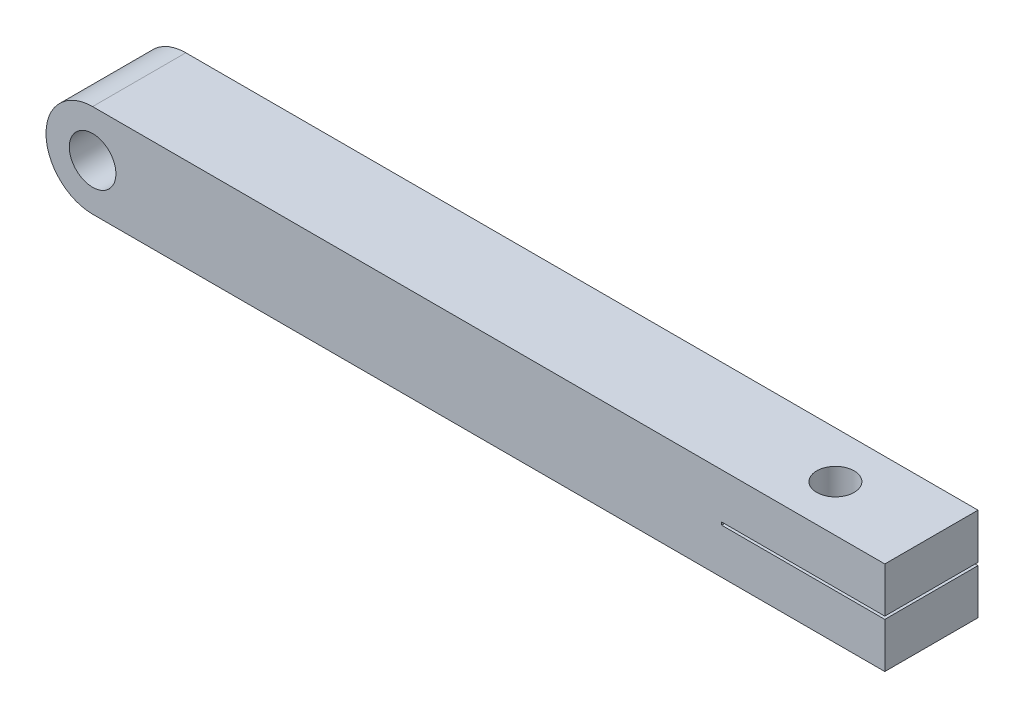
ISO-10303-21;
HEADER;
FILE_DESCRIPTION(('STEP AP214'),'2;1');
FILE_NAME('part.step','',(''),(''),'','','');
FILE_SCHEMA(('AUTOMOTIVE_DESIGN { 1 0 10303 214 1 1 1 1 }'));
ENDSEC;
DATA;
#1=APPLICATION_CONTEXT('core data for automotive mechanical design processes');
#2=APPLICATION_PROTOCOL_DEFINITION('international standard','automotive_design',2000,#1);
#3=PRODUCT_CONTEXT('',#1,'mechanical');
#4=PRODUCT('Part','Part','',(#3));
#5=PRODUCT_RELATED_PRODUCT_CATEGORY('part','',(#4));
#6=PRODUCT_DEFINITION_FORMATION('','',#4);
#7=PRODUCT_DEFINITION_CONTEXT('part definition',#1,'design');
#8=PRODUCT_DEFINITION('design','',#6,#7);
#9=PRODUCT_DEFINITION_SHAPE('','',#8);
#10=(LENGTH_UNIT() NAMED_UNIT(*) SI_UNIT(.MILLI.,.METRE.));
#11=(NAMED_UNIT(*) PLANE_ANGLE_UNIT() SI_UNIT($,.RADIAN.));
#12=(NAMED_UNIT(*) SI_UNIT($,.STERADIAN.) SOLID_ANGLE_UNIT());
#13=UNCERTAINTY_MEASURE_WITH_UNIT(LENGTH_MEASURE(1.E-05),#10,'distance_accuracy_value','');
#14=(GEOMETRIC_REPRESENTATION_CONTEXT(3) GLOBAL_UNCERTAINTY_ASSIGNED_CONTEXT((#13)) GLOBAL_UNIT_ASSIGNED_CONTEXT((#10,
#11,#12)) REPRESENTATION_CONTEXT('',''));
#15=CARTESIAN_POINT('',(0.,0.,0.));
#16=DIRECTION('',(0.,0.,1.));
#17=DIRECTION('',(1.,0.,0.));
#18=AXIS2_PLACEMENT_3D('',#15,#16,#17);
#19=CARTESIAN_POINT('',(0.,0.,12.7));
#20=DIRECTION('',(0.,0.,1.));
#21=DIRECTION('',(1.,0.,0.));
#22=AXIS2_PLACEMENT_3D('',#19,#20,#21);
#23=PLANE('',#22);
#24=DIRECTION('',(0.,1.,0.));
#25=VECTOR('',#24,1.);
#26=CARTESIAN_POINT('',(107.95,6.35,12.7));
#27=LINE('',#26,#25);
#28=CARTESIAN_POINT('',(107.95,0.190500000000001,12.7));
#29=VERTEX_POINT('',#28);
#30=CARTESIAN_POINT('',(107.95,6.35,12.7));
#31=VERTEX_POINT('',#30);
#32=EDGE_CURVE('E151',#29,#31,#27,.T.);
#33=ORIENTED_EDGE('',*,*,#32,.T.);
#34=DIRECTION('',(-1.,0.,0.));
#35=VECTOR('',#34,1.);
#36=CARTESIAN_POINT('',(0.,6.35,12.7));
#37=LINE('',#36,#35);
#38=CARTESIAN_POINT('',(0.,6.35,12.7));
#39=VERTEX_POINT('',#38);
#40=EDGE_CURVE('E99',#31,#39,#37,.T.);
#41=ORIENTED_EDGE('',*,*,#40,.T.);
#42=CARTESIAN_POINT('',(0.,0.,12.7));
#43=DIRECTION('',(0.,0.,1.));
#44=DIRECTION('',(1.,0.,0.));
#45=AXIS2_PLACEMENT_3D('',#42,#43,#44);
#46=CIRCLE('',#45,6.35000000000002);
#47=CARTESIAN_POINT('',(7.14267211143019E-07,-6.34999999999998,12.7));
#48=VERTEX_POINT('',#47);
#49=EDGE_CURVE('E167',#39,#48,#46,.T.);
#50=ORIENTED_EDGE('',*,*,#49,.T.);
#51=DIRECTION('',(1.,0.,0.));
#52=VECTOR('',#51,1.);
#53=CARTESIAN_POINT('',(7.1426721568596E-07,-6.35,12.7));
#54=LINE('',#53,#52);
#55=CARTESIAN_POINT('',(107.95,-6.35,12.7));
#56=VERTEX_POINT('',#55);
#57=EDGE_CURVE('E180',#48,#56,#54,.T.);
#58=ORIENTED_EDGE('',*,*,#57,.T.);
#59=DIRECTION('',(0.,1.,0.));
#60=VECTOR('',#59,1.);
#61=CARTESIAN_POINT('',(107.95,-6.35,12.7));
#62=LINE('',#61,#60);
#63=CARTESIAN_POINT('',(107.95,-0.1905,12.7));
#64=VERTEX_POINT('',#63);
#65=EDGE_CURVE('E118',#56,#64,#62,.T.);
#66=ORIENTED_EDGE('',*,*,#65,.T.);
#67=DIRECTION('',(-1.,0.,0.));
#68=VECTOR('',#67,1.);
#69=CARTESIAN_POINT('',(85.725,-0.1905,12.7));
#70=LINE('',#69,#68);
#71=CARTESIAN_POINT('',(85.725,-0.1905,12.7));
#72=VERTEX_POINT('',#71);
#73=EDGE_CURVE('E112',#64,#72,#70,.T.);
#74=ORIENTED_EDGE('',*,*,#73,.T.);
#75=DIRECTION('',(0.,1.,0.));
#76=VECTOR('',#75,1.);
#77=CARTESIAN_POINT('',(85.725,0.190500000000001,12.7));
#78=LINE('',#77,#76);
#79=CARTESIAN_POINT('',(85.725,0.190500000000001,12.7));
#80=VERTEX_POINT('',#79);
#81=EDGE_CURVE('E116',#72,#80,#78,.T.);
#82=ORIENTED_EDGE('',*,*,#81,.T.);
#83=DIRECTION('',(1.,0.,0.));
#84=VECTOR('',#83,1.);
#85=CARTESIAN_POINT('',(107.95,0.190500000000001,12.7));
#86=LINE('',#85,#84);
#87=EDGE_CURVE('E56',#80,#29,#86,.T.);
#88=ORIENTED_EDGE('',*,*,#87,.T.);
#89=EDGE_LOOP('',(#33,#41,#50,#58,#66,#74,#82,#88));
#90=FACE_BOUND('',#89,.T.);
#91=CARTESIAN_POINT('',(0.,0.,12.7));
#92=DIRECTION('',(0.,0.,1.));
#93=DIRECTION('',(1.,0.,0.));
#94=AXIS2_PLACEMENT_3D('',#91,#92,#93);
#95=CIRCLE('',#94,3.175);
#96=CARTESIAN_POINT('',(3.175,0.,12.7));
#97=VERTEX_POINT('',#96);
#98=EDGE_CURVE('E140',#97,#97,#95,.T.);
#99=ORIENTED_EDGE('',*,*,#98,.F.);
#100=EDGE_LOOP('',(#99));
#101=FACE_BOUND('',#100,.T.);
#102=ADVANCED_FACE('F38',(#90,#101),#23,.T.);
#103=CARTESIAN_POINT('',(0.,0.,0.));
#104=DIRECTION('',(0.,0.,1.));
#105=DIRECTION('',(1.,0.,0.));
#106=AXIS2_PLACEMENT_3D('',#103,#104,#105);
#107=PLANE('',#106);
#108=DIRECTION('',(0.,1.,0.));
#109=VECTOR('',#108,1.);
#110=CARTESIAN_POINT('',(107.95,6.35,0.));
#111=LINE('',#110,#109);
#112=CARTESIAN_POINT('',(107.95,0.190500000000001,0.));
#113=VERTEX_POINT('',#112);
#114=CARTESIAN_POINT('',(107.95,6.35,0.));
#115=VERTEX_POINT('',#114);
#116=EDGE_CURVE('E136',#113,#115,#111,.T.);
#117=ORIENTED_EDGE('',*,*,#116,.F.);
#118=DIRECTION('',(1.,0.,0.));
#119=VECTOR('',#118,1.);
#120=CARTESIAN_POINT('',(107.95,0.190500000000001,0.));
#121=LINE('',#120,#119);
#122=CARTESIAN_POINT('',(85.725,0.190500000000001,0.));
#123=VERTEX_POINT('',#122);
#124=EDGE_CURVE('E91',#123,#113,#121,.T.);
#125=ORIENTED_EDGE('',*,*,#124,.F.);
#126=DIRECTION('',(0.,1.,0.));
#127=VECTOR('',#126,1.);
#128=CARTESIAN_POINT('',(85.725,0.190500000000001,0.));
#129=LINE('',#128,#127);
#130=CARTESIAN_POINT('',(85.725,-0.1905,0.));
#131=VERTEX_POINT('',#130);
#132=EDGE_CURVE('E85',#131,#123,#129,.T.);
#133=ORIENTED_EDGE('',*,*,#132,.F.);
#134=DIRECTION('',(-1.,0.,0.));
#135=VECTOR('',#134,1.);
#136=CARTESIAN_POINT('',(85.725,-0.1905,0.));
#137=LINE('',#136,#135);
#138=CARTESIAN_POINT('',(107.95,-0.1905,0.));
#139=VERTEX_POINT('',#138);
#140=EDGE_CURVE('E126',#139,#131,#137,.T.);
#141=ORIENTED_EDGE('',*,*,#140,.F.);
#142=DIRECTION('',(0.,1.,0.));
#143=VECTOR('',#142,1.);
#144=CARTESIAN_POINT('',(107.95,-6.35,0.));
#145=LINE('',#144,#143);
#146=CARTESIAN_POINT('',(107.95,-6.35,0.));
#147=VERTEX_POINT('',#146);
#148=EDGE_CURVE('E146',#147,#139,#145,.T.);
#149=ORIENTED_EDGE('',*,*,#148,.F.);
#150=DIRECTION('',(1.,0.,0.));
#151=VECTOR('',#150,1.);
#152=CARTESIAN_POINT('',(7.1426721568596E-07,-6.35,0.));
#153=LINE('',#152,#151);
#154=CARTESIAN_POINT('',(7.14267211143019E-07,-6.34999999999998,0.));
#155=VERTEX_POINT('',#154);
#156=EDGE_CURVE('E144',#155,#147,#153,.T.);
#157=ORIENTED_EDGE('',*,*,#156,.F.);
#158=CARTESIAN_POINT('',(0.,0.,0.));
#159=DIRECTION('',(0.,0.,1.));
#160=DIRECTION('',(1.,0.,0.));
#161=AXIS2_PLACEMENT_3D('',#158,#159,#160);
#162=CIRCLE('',#161,6.35000000000002);
#163=CARTESIAN_POINT('',(0.,6.35,0.));
#164=VERTEX_POINT('',#163);
#165=EDGE_CURVE('E142',#164,#155,#162,.T.);
#166=ORIENTED_EDGE('',*,*,#165,.F.);
#167=DIRECTION('',(-1.,0.,0.));
#168=VECTOR('',#167,1.);
#169=CARTESIAN_POINT('',(0.,6.35,0.));
#170=LINE('',#169,#168);
#171=EDGE_CURVE('E139',#115,#164,#170,.T.);
#172=ORIENTED_EDGE('',*,*,#171,.F.);
#173=EDGE_LOOP('',(#117,#125,#133,#141,#149,#157,#166,#172));
#174=FACE_BOUND('',#173,.T.);
#175=CARTESIAN_POINT('',(0.,0.,0.));
#176=DIRECTION('',(0.,0.,1.));
#177=DIRECTION('',(1.,0.,0.));
#178=AXIS2_PLACEMENT_3D('',#175,#176,#177);
#179=CIRCLE('',#178,3.175);
#180=CARTESIAN_POINT('',(3.175,0.,0.));
#181=VERTEX_POINT('',#180);
#182=EDGE_CURVE('E186',#181,#181,#179,.T.);
#183=ORIENTED_EDGE('',*,*,#182,.T.);
#184=EDGE_LOOP('',(#183));
#185=FACE_BOUND('',#184,.T.);
#186=ADVANCED_FACE('F171',(#174,#185),#107,.F.);
#187=CARTESIAN_POINT('',(107.95,6.35,12.7));
#188=DIRECTION('',(-1.,0.,0.));
#189=DIRECTION('',(0.,0.,1.));
#190=AXIS2_PLACEMENT_3D('',#187,#188,#189);
#191=PLANE('',#190);
#192=ORIENTED_EDGE('',*,*,#116,.T.);
#193=DIRECTION('',(0.,0.,-1.));
#194=VECTOR('',#193,1.);
#195=CARTESIAN_POINT('',(107.95,6.35,12.7));
#196=LINE('',#195,#194);
#197=EDGE_CURVE('E11',#31,#115,#196,.T.);
#198=ORIENTED_EDGE('',*,*,#197,.F.);
#199=ORIENTED_EDGE('',*,*,#32,.F.);
#200=DIRECTION('',(0.,0.,-1.));
#201=VECTOR('',#200,1.);
#202=CARTESIAN_POINT('',(107.95,0.190500000000001,12.7));
#203=LINE('',#202,#201);
#204=EDGE_CURVE('E132',#29,#113,#203,.T.);
#205=ORIENTED_EDGE('',*,*,#204,.T.);
#206=EDGE_LOOP('',(#192,#198,#199,#205));
#207=FACE_BOUND('',#206,.T.);
#208=ADVANCED_FACE('F40',(#207),#191,.F.);
#209=CARTESIAN_POINT('',(0.,6.35,12.7));
#210=DIRECTION('',(0.,-1.,0.));
#211=DIRECTION('',(0.,0.,-1.));
#212=AXIS2_PLACEMENT_3D('',#209,#210,#211);
#213=PLANE('',#212);
#214=CARTESIAN_POINT('',(94.869,6.35,6.35));
#215=DIRECTION('',(0.,1.,0.));
#216=DIRECTION('',(0.,0.,1.));
#217=AXIS2_PLACEMENT_3D('',#214,#215,#216);
#218=CIRCLE('',#217,2.55269999999999);
#219=CARTESIAN_POINT('',(94.869,6.35,8.90269999999999));
#220=VERTEX_POINT('',#219);
#221=EDGE_CURVE('E197',#220,#220,#218,.T.);
#222=ORIENTED_EDGE('',*,*,#221,.F.);
#223=EDGE_LOOP('',(#222));
#224=FACE_BOUND('',#223,.T.);
#225=ORIENTED_EDGE('',*,*,#171,.T.);
#226=DIRECTION('',(0.,0.,-1.));
#227=VECTOR('',#226,1.);
#228=CARTESIAN_POINT('',(0.,6.35,12.7));
#229=LINE('',#228,#227);
#230=EDGE_CURVE('E48',#39,#164,#229,.T.);
#231=ORIENTED_EDGE('',*,*,#230,.F.);
#232=ORIENTED_EDGE('',*,*,#40,.F.);
#233=ORIENTED_EDGE('',*,*,#197,.T.);
#234=EDGE_LOOP('',(#225,#231,#232,#233));
#235=FACE_BOUND('',#234,.T.);
#236=ADVANCED_FACE('F204',(#224,#235),#213,.F.);
#237=CARTESIAN_POINT('',(0.,0.,12.7));
#238=DIRECTION('',(0.,0.,-1.));
#239=DIRECTION('',(-1.,0.,0.));
#240=AXIS2_PLACEMENT_3D('',#237,#238,#239);
#241=CYLINDRICAL_SURFACE('',#240,6.35000000000002);
#242=ORIENTED_EDGE('',*,*,#165,.T.);
#243=DIRECTION('',(0.,0.,-1.));
#244=VECTOR('',#243,1.);
#245=CARTESIAN_POINT('',(7.14267211143019E-07,-6.34999999999998,12.7));
#246=LINE('',#245,#244);
#247=EDGE_CURVE('E158',#48,#155,#246,.T.);
#248=ORIENTED_EDGE('',*,*,#247,.F.);
#249=ORIENTED_EDGE('',*,*,#49,.F.);
#250=ORIENTED_EDGE('',*,*,#230,.T.);
#251=EDGE_LOOP('',(#242,#248,#249,#250));
#252=FACE_BOUND('',#251,.T.);
#253=ADVANCED_FACE('F165',(#252),#241,.T.);
#254=CARTESIAN_POINT('',(7.1426721568596E-07,-6.35,12.7));
#255=DIRECTION('',(0.,1.,0.));
#256=DIRECTION('',(-1.,0.,0.));
#257=AXIS2_PLACEMENT_3D('',#254,#255,#256);
#258=PLANE('',#257);
#259=CARTESIAN_POINT('',(94.869,-6.35,6.35));
#260=DIRECTION('',(0.,1.,0.));
#261=DIRECTION('',(0.,0.,1.));
#262=AXIS2_PLACEMENT_3D('',#259,#260,#261);
#263=CIRCLE('',#262,2.55269999999999);
#264=CARTESIAN_POINT('',(94.869,-6.35,8.90269999999999));
#265=VERTEX_POINT('',#264);
#266=EDGE_CURVE('E194',#265,#265,#263,.T.);
#267=ORIENTED_EDGE('',*,*,#266,.T.);
#268=EDGE_LOOP('',(#267));
#269=FACE_BOUND('',#268,.T.);
#270=ORIENTED_EDGE('',*,*,#156,.T.);
#271=DIRECTION('',(0.,0.,-1.));
#272=VECTOR('',#271,1.);
#273=CARTESIAN_POINT('',(107.95,-6.35,12.7));
#274=LINE('',#273,#272);
#275=EDGE_CURVE('E155',#56,#147,#274,.T.);
#276=ORIENTED_EDGE('',*,*,#275,.F.);
#277=ORIENTED_EDGE('',*,*,#57,.F.);
#278=ORIENTED_EDGE('',*,*,#247,.T.);
#279=EDGE_LOOP('',(#270,#276,#277,#278));
#280=FACE_BOUND('',#279,.T.);
#281=ADVANCED_FACE('F176',(#269,#280),#258,.F.);
#282=CARTESIAN_POINT('',(107.95,-6.35,12.7));
#283=DIRECTION('',(-1.,0.,0.));
#284=DIRECTION('',(0.,0.,1.));
#285=AXIS2_PLACEMENT_3D('',#282,#283,#284);
#286=PLANE('',#285);
#287=ORIENTED_EDGE('',*,*,#148,.T.);
#288=DIRECTION('',(0.,0.,-1.));
#289=VECTOR('',#288,1.);
#290=CARTESIAN_POINT('',(107.95,-0.1905,12.7));
#291=LINE('',#290,#289);
#292=EDGE_CURVE('E127',#64,#139,#291,.T.);
#293=ORIENTED_EDGE('',*,*,#292,.F.);
#294=ORIENTED_EDGE('',*,*,#65,.F.);
#295=ORIENTED_EDGE('',*,*,#275,.T.);
#296=EDGE_LOOP('',(#287,#293,#294,#295));
#297=FACE_BOUND('',#296,.T.);
#298=ADVANCED_FACE('F179',(#297),#286,.F.);
#299=CARTESIAN_POINT('',(85.725,-0.1905,12.7));
#300=DIRECTION('',(0.,-1.,0.));
#301=DIRECTION('',(0.,0.,-1.));
#302=AXIS2_PLACEMENT_3D('',#299,#300,#301);
#303=PLANE('',#302);
#304=CARTESIAN_POINT('',(94.869,-0.1905,6.35));
#305=DIRECTION('',(0.,-1.,0.));
#306=DIRECTION('',(0.,0.,-1.));
#307=AXIS2_PLACEMENT_3D('',#304,#305,#306);
#308=CIRCLE('',#307,2.55269999999999);
#309=CARTESIAN_POINT('',(94.869,-0.1905,3.79730000000001));
#310=VERTEX_POINT('',#309);
#311=EDGE_CURVE('E189',#310,#310,#308,.T.);
#312=ORIENTED_EDGE('',*,*,#311,.T.);
#313=EDGE_LOOP('',(#312));
#314=FACE_BOUND('',#313,.T.);
#315=ORIENTED_EDGE('',*,*,#140,.T.);
#316=DIRECTION('',(0.,0.,-1.));
#317=VECTOR('',#316,1.);
#318=CARTESIAN_POINT('',(85.725,-0.1905,12.7));
#319=LINE('',#318,#317);
#320=EDGE_CURVE('E123',#72,#131,#319,.T.);
#321=ORIENTED_EDGE('',*,*,#320,.F.);
#322=ORIENTED_EDGE('',*,*,#73,.F.);
#323=ORIENTED_EDGE('',*,*,#292,.T.);
#324=EDGE_LOOP('',(#315,#321,#322,#323));
#325=FACE_BOUND('',#324,.T.);
#326=ADVANCED_FACE('F124',(#314,#325),#303,.F.);
#327=CARTESIAN_POINT('',(85.725,0.190500000000001,12.7));
#328=DIRECTION('',(-1.,0.,0.));
#329=DIRECTION('',(0.,0.,1.));
#330=AXIS2_PLACEMENT_3D('',#327,#328,#329);
#331=PLANE('',#330);
#332=ORIENTED_EDGE('',*,*,#132,.T.);
#333=DIRECTION('',(0.,0.,-1.));
#334=VECTOR('',#333,1.);
#335=CARTESIAN_POINT('',(85.725,0.190500000000001,12.7));
#336=LINE('',#335,#334);
#337=EDGE_CURVE('E128',#80,#123,#336,.T.);
#338=ORIENTED_EDGE('',*,*,#337,.F.);
#339=ORIENTED_EDGE('',*,*,#81,.F.);
#340=ORIENTED_EDGE('',*,*,#320,.T.);
#341=EDGE_LOOP('',(#332,#338,#339,#340));
#342=FACE_BOUND('',#341,.T.);
#343=ADVANCED_FACE('F130',(#342),#331,.F.);
#344=CARTESIAN_POINT('',(107.95,0.190500000000001,12.7));
#345=DIRECTION('',(0.,1.,0.));
#346=DIRECTION('',(0.,0.,1.));
#347=AXIS2_PLACEMENT_3D('',#344,#345,#346);
#348=PLANE('',#347);
#349=CARTESIAN_POINT('',(94.869,0.190500000000001,6.35));
#350=DIRECTION('',(0.,1.,0.));
#351=DIRECTION('',(0.,0.,1.));
#352=AXIS2_PLACEMENT_3D('',#349,#350,#351);
#353=CIRCLE('',#352,2.55269999999999);
#354=CARTESIAN_POINT('',(94.869,0.190500000000001,8.90269999999999));
#355=VERTEX_POINT('',#354);
#356=EDGE_CURVE('E42',#355,#355,#353,.T.);
#357=ORIENTED_EDGE('',*,*,#356,.T.);
#358=EDGE_LOOP('',(#357));
#359=FACE_BOUND('',#358,.T.);
#360=ORIENTED_EDGE('',*,*,#124,.T.);
#361=ORIENTED_EDGE('',*,*,#204,.F.);
#362=ORIENTED_EDGE('',*,*,#87,.F.);
#363=ORIENTED_EDGE('',*,*,#337,.T.);
#364=EDGE_LOOP('',(#360,#361,#362,#363));
#365=FACE_BOUND('',#364,.T.);
#366=ADVANCED_FACE('F209',(#359,#365),#348,.F.);
#367=CARTESIAN_POINT('',(0.,0.,12.7));
#368=DIRECTION('',(0.,0.,-1.));
#369=DIRECTION('',(-1.,0.,0.));
#370=AXIS2_PLACEMENT_3D('',#367,#368,#369);
#371=CYLINDRICAL_SURFACE('',#370,3.175);
#372=ORIENTED_EDGE('',*,*,#98,.T.);
#373=EDGE_LOOP('',(#372));
#374=FACE_BOUND('',#373,.T.);
#375=ORIENTED_EDGE('',*,*,#182,.F.);
#376=EDGE_LOOP('',(#375));
#377=FACE_BOUND('',#376,.T.);
#378=ADVANCED_FACE('F211',(#374,#377),#371,.F.);
#379=CARTESIAN_POINT('',(94.869,6.35,6.35));
#380=DIRECTION('',(0.,1.,0.));
#381=DIRECTION('',(0.,0.,1.));
#382=AXIS2_PLACEMENT_3D('',#379,#380,#381);
#383=CYLINDRICAL_SURFACE('',#382,2.55269999999999);
#384=ORIENTED_EDGE('',*,*,#221,.T.);
#385=EDGE_LOOP('',(#384));
#386=FACE_BOUND('',#385,.T.);
#387=ORIENTED_EDGE('',*,*,#356,.F.);
#388=EDGE_LOOP('',(#387));
#389=FACE_BOUND('',#388,.T.);
#390=ADVANCED_FACE('F201',(#386,#389),#383,.F.);
#391=ORIENTED_EDGE('',*,*,#266,.F.);
#392=EDGE_LOOP('',(#391));
#393=FACE_BOUND('',#392,.T.);
#394=ORIENTED_EDGE('',*,*,#311,.F.);
#395=EDGE_LOOP('',(#394));
#396=FACE_BOUND('',#395,.T.);
#397=ADVANCED_FACE('F229',(#393,#396),#383,.F.);
#398=CLOSED_SHELL('',(#102,#186,#208,#236,#253,#281,#298,#326,#343,#366,#378,#390,#397));
#399=MANIFOLD_SOLID_BREP('B2',#398);
#400=ADVANCED_BREP_SHAPE_REPRESENTATION('',(#18,#399),#14);
#401=SHAPE_DEFINITION_REPRESENTATION(#9,#400);
ENDSEC;
END-ISO-10303-21;
